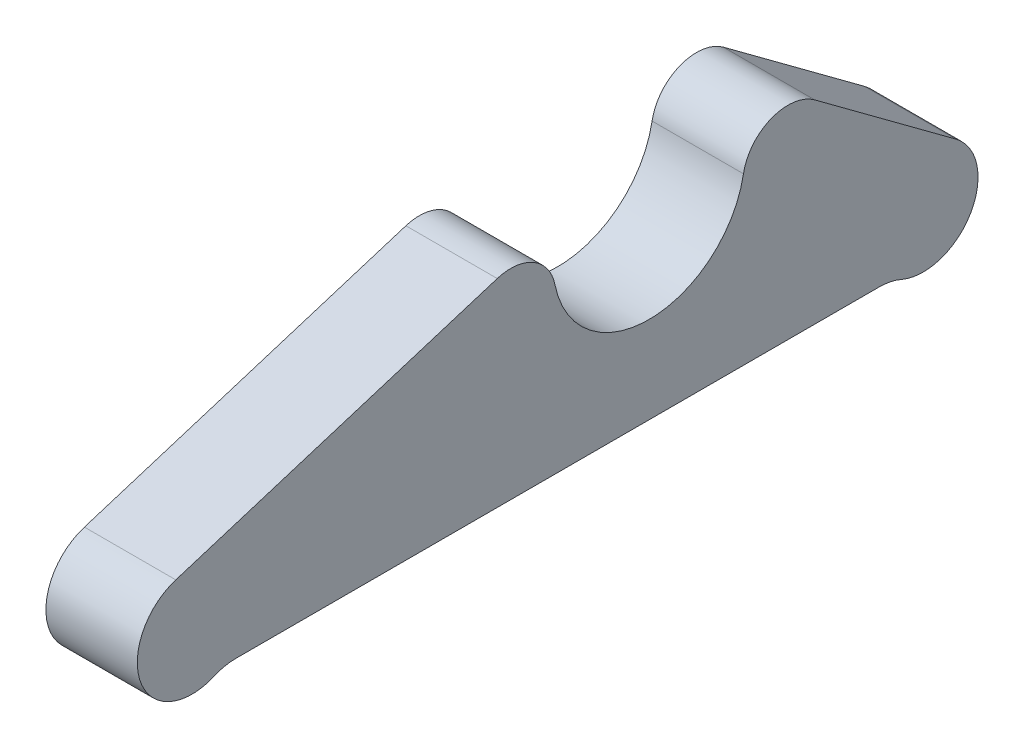
ISO-10303-21;
HEADER;
FILE_DESCRIPTION(('STEP AP214'),'2;1');
FILE_NAME('part.step','',(''),(''),'','','');
FILE_SCHEMA(('AUTOMOTIVE_DESIGN { 1 0 10303 214 1 1 1 1 }'));
ENDSEC;
DATA;
#1=APPLICATION_CONTEXT('core data for automotive mechanical design processes');
#2=APPLICATION_PROTOCOL_DEFINITION('international standard','automotive_design',2000,#1);
#3=PRODUCT_CONTEXT('',#1,'mechanical');
#4=PRODUCT('Part','Part','',(#3));
#5=PRODUCT_RELATED_PRODUCT_CATEGORY('part','',(#4));
#6=PRODUCT_DEFINITION_FORMATION('','',#4);
#7=PRODUCT_DEFINITION_CONTEXT('part definition',#1,'design');
#8=PRODUCT_DEFINITION('design','',#6,#7);
#9=PRODUCT_DEFINITION_SHAPE('','',#8);
#10=(LENGTH_UNIT() NAMED_UNIT(*) SI_UNIT(.MILLI.,.METRE.));
#11=(NAMED_UNIT(*) PLANE_ANGLE_UNIT() SI_UNIT($,.RADIAN.));
#12=(NAMED_UNIT(*) SI_UNIT($,.STERADIAN.) SOLID_ANGLE_UNIT());
#13=UNCERTAINTY_MEASURE_WITH_UNIT(LENGTH_MEASURE(1.E-05),#10,'distance_accuracy_value','');
#14=(GEOMETRIC_REPRESENTATION_CONTEXT(3) GLOBAL_UNCERTAINTY_ASSIGNED_CONTEXT((#13)) GLOBAL_UNIT_ASSIGNED_CONTEXT((#10,
#11,#12)) REPRESENTATION_CONTEXT('',''));
#15=CARTESIAN_POINT('',(0.,0.,0.));
#16=DIRECTION('',(0.,0.,1.));
#17=DIRECTION('',(1.,0.,0.));
#18=AXIS2_PLACEMENT_3D('',#15,#16,#17);
#19=CARTESIAN_POINT('',(10.,-15.,50.));
#20=DIRECTION('',(-1.,0.,0.));
#21=DIRECTION('',(0.,0.,1.));
#22=AXIS2_PLACEMENT_3D('',#19,#20,#21);
#23=CYLINDRICAL_SURFACE('',#22,6.);
#24=CARTESIAN_POINT('',(0.,-15.,50.));
#25=DIRECTION('',(1.,0.,0.));
#26=DIRECTION('',(0.,0.,-1.));
#27=AXIS2_PLACEMENT_3D('',#24,#25,#26);
#28=CIRCLE('',#27,6.);
#29=CARTESIAN_POINT('',(0.,-9.27202973874664,51.7861569601233));
#30=VERTEX_POINT('',#29);
#31=CARTESIAN_POINT('',(0.,-20.5,47.6020842383436));
#32=VERTEX_POINT('',#31);
#33=EDGE_CURVE('E152',#30,#32,#28,.T.);
#34=ORIENTED_EDGE('',*,*,#33,.T.);
#35=DIRECTION('',(-1.,0.,0.));
#36=VECTOR('',#35,1.);
#37=CARTESIAN_POINT('',(10.,-20.5,47.6020842383436));
#38=LINE('',#37,#36);
#39=CARTESIAN_POINT('',(10.,-20.5,47.6020842383436));
#40=VERTEX_POINT('',#39);
#41=EDGE_CURVE('E11',#40,#32,#38,.T.);
#42=ORIENTED_EDGE('',*,*,#41,.F.);
#43=CARTESIAN_POINT('',(10.,-15.,50.));
#44=DIRECTION('',(1.,0.,0.));
#45=DIRECTION('',(0.,0.,-1.));
#46=AXIS2_PLACEMENT_3D('',#43,#44,#45);
#47=CIRCLE('',#46,6.);
#48=CARTESIAN_POINT('',(10.,-9.27202973874664,51.7861569601233));
#49=VERTEX_POINT('',#48);
#50=EDGE_CURVE('E180',#49,#40,#47,.T.);
#51=ORIENTED_EDGE('',*,*,#50,.F.);
#52=DIRECTION('',(-1.,0.,0.));
#53=VECTOR('',#52,1.);
#54=CARTESIAN_POINT('',(10.,-9.27202973874664,51.7861569601233));
#55=LINE('',#54,#53);
#56=EDGE_CURVE('E148',#49,#30,#55,.T.);
#57=ORIENTED_EDGE('',*,*,#56,.T.);
#58=EDGE_LOOP('',(#34,#42,#51,#57));
#59=FACE_BOUND('',#58,.T.);
#60=ADVANCED_FACE('F39',(#59),#23,.T.);
#61=CARTESIAN_POINT('',(10.,-26.,45.2041684766873));
#62=DIRECTION('',(-1.,0.,0.));
#63=DIRECTION('',(0.,0.,1.));
#64=AXIS2_PLACEMENT_3D('',#61,#62,#63);
#65=CYLINDRICAL_SURFACE('',#64,6.);
#66=CARTESIAN_POINT('',(0.,-26.,45.2041684766873));
#67=DIRECTION('',(-1.,0.,0.));
#68=DIRECTION('',(0.,0.,-1.));
#69=AXIS2_PLACEMENT_3D('',#66,#67,#68);
#70=CIRCLE('',#69,6.);
#71=CARTESIAN_POINT('',(0.,-20.,45.2041684766873));
#72=VERTEX_POINT('',#71);
#73=EDGE_CURVE('E156',#32,#72,#70,.T.);
#74=ORIENTED_EDGE('',*,*,#73,.T.);
#75=DIRECTION('',(-1.,0.,0.));
#76=VECTOR('',#75,1.);
#77=CARTESIAN_POINT('',(10.,-20.,45.2041684766873));
#78=LINE('',#77,#76);
#79=CARTESIAN_POINT('',(10.,-20.,45.2041684766873));
#80=VERTEX_POINT('',#79);
#81=EDGE_CURVE('E48',#80,#72,#78,.T.);
#82=ORIENTED_EDGE('',*,*,#81,.F.);
#83=CARTESIAN_POINT('',(10.,-26.,45.2041684766873));
#84=DIRECTION('',(-1.,0.,0.));
#85=DIRECTION('',(0.,0.,-1.));
#86=AXIS2_PLACEMENT_3D('',#83,#84,#85);
#87=CIRCLE('',#86,6.);
#88=EDGE_CURVE('E105',#40,#80,#87,.T.);
#89=ORIENTED_EDGE('',*,*,#88,.F.);
#90=ORIENTED_EDGE('',*,*,#41,.T.);
#91=EDGE_LOOP('',(#74,#82,#89,#90));
#92=FACE_BOUND('',#91,.T.);
#93=ADVANCED_FACE('F244',(#92),#65,.F.);
#94=CARTESIAN_POINT('',(10.,-20.,45.2041684766873));
#95=DIRECTION('',(0.,1.,0.));
#96=DIRECTION('',(0.,0.,1.));
#97=AXIS2_PLACEMENT_3D('',#94,#95,#96);
#98=PLANE('',#97);
#99=DIRECTION('',(0.,0.,-1.));
#100=VECTOR('',#99,1.);
#101=CARTESIAN_POINT('',(0.,-20.,45.2041684766873));
#102=LINE('',#101,#100);
#103=CARTESIAN_POINT('',(0.,-20.,-25.2041684766873));
#104=VERTEX_POINT('',#103);
#105=EDGE_CURVE('E159',#72,#104,#102,.T.);
#106=ORIENTED_EDGE('',*,*,#105,.T.);
#107=DIRECTION('',(-1.,0.,0.));
#108=VECTOR('',#107,1.);
#109=CARTESIAN_POINT('',(10.,-20.,-25.2041684766873));
#110=LINE('',#109,#108);
#111=CARTESIAN_POINT('',(10.,-20.,-25.2041684766873));
#112=VERTEX_POINT('',#111);
#113=EDGE_CURVE('E199',#112,#104,#110,.T.);
#114=ORIENTED_EDGE('',*,*,#113,.F.);
#115=DIRECTION('',(0.,0.,-1.));
#116=VECTOR('',#115,1.);
#117=CARTESIAN_POINT('',(10.,-20.,45.2041684766873));
#118=LINE('',#117,#116);
#119=EDGE_CURVE('E209',#80,#112,#118,.T.);
#120=ORIENTED_EDGE('',*,*,#119,.F.);
#121=ORIENTED_EDGE('',*,*,#81,.T.);
#122=EDGE_LOOP('',(#106,#114,#120,#121));
#123=FACE_BOUND('',#122,.T.);
#124=ADVANCED_FACE('F207',(#123),#98,.F.);
#125=CARTESIAN_POINT('',(10.,-26.,-25.2041684766873));
#126=DIRECTION('',(-1.,0.,0.));
#127=DIRECTION('',(0.,0.,1.));
#128=AXIS2_PLACEMENT_3D('',#125,#126,#127);
#129=CYLINDRICAL_SURFACE('',#128,6.);
#130=CARTESIAN_POINT('',(0.,-26.,-25.2041684766873));
#131=DIRECTION('',(-1.,0.,0.));
#132=DIRECTION('',(0.,0.,1.));
#133=AXIS2_PLACEMENT_3D('',#130,#131,#132);
#134=CIRCLE('',#133,6.);
#135=CARTESIAN_POINT('',(0.,-20.5,-27.6020842383436));
#136=VERTEX_POINT('',#135);
#137=EDGE_CURVE('E162',#104,#136,#134,.T.);
#138=ORIENTED_EDGE('',*,*,#137,.T.);
#139=DIRECTION('',(-1.,0.,0.));
#140=VECTOR('',#139,1.);
#141=CARTESIAN_POINT('',(10.,-20.5,-27.6020842383436));
#142=LINE('',#141,#140);
#143=CARTESIAN_POINT('',(10.,-20.5,-27.6020842383436));
#144=VERTEX_POINT('',#143);
#145=EDGE_CURVE('E195',#144,#136,#142,.T.);
#146=ORIENTED_EDGE('',*,*,#145,.F.);
#147=CARTESIAN_POINT('',(10.,-26.,-25.2041684766873));
#148=DIRECTION('',(-1.,0.,0.));
#149=DIRECTION('',(0.,0.,1.));
#150=AXIS2_PLACEMENT_3D('',#147,#148,#149);
#151=CIRCLE('',#150,6.);
#152=EDGE_CURVE('E228',#112,#144,#151,.T.);
#153=ORIENTED_EDGE('',*,*,#152,.F.);
#154=ORIENTED_EDGE('',*,*,#113,.T.);
#155=EDGE_LOOP('',(#138,#146,#153,#154));
#156=FACE_BOUND('',#155,.T.);
#157=ADVANCED_FACE('F218',(#156),#129,.F.);
#158=CARTESIAN_POINT('',(10.,-15.,-30.));
#159=DIRECTION('',(-1.,0.,0.));
#160=DIRECTION('',(0.,0.,1.));
#161=AXIS2_PLACEMENT_3D('',#158,#159,#160);
#162=CYLINDRICAL_SURFACE('',#161,6.);
#163=CARTESIAN_POINT('',(0.,-15.,-30.));
#164=DIRECTION('',(1.,0.,0.));
#165=DIRECTION('',(0.,0.,1.));
#166=AXIS2_PLACEMENT_3D('',#163,#164,#165);
#167=CIRCLE('',#166,6.);
#168=CARTESIAN_POINT('',(0.,-10.1780659532109,-33.5705674686828));
#169=VERTEX_POINT('',#168);
#170=EDGE_CURVE('E165',#136,#169,#167,.T.);
#171=ORIENTED_EDGE('',*,*,#170,.T.);
#172=DIRECTION('',(-1.,0.,0.));
#173=VECTOR('',#172,1.);
#174=CARTESIAN_POINT('',(10.,-10.1780659532109,-33.5705674686828));
#175=LINE('',#174,#173);
#176=CARTESIAN_POINT('',(10.,-10.1780659532109,-33.5705674686828));
#177=VERTEX_POINT('',#176);
#178=EDGE_CURVE('E191',#177,#169,#175,.T.);
#179=ORIENTED_EDGE('',*,*,#178,.F.);
#180=CARTESIAN_POINT('',(10.,-15.,-30.));
#181=DIRECTION('',(1.,0.,0.));
#182=DIRECTION('',(0.,0.,1.));
#183=AXIS2_PLACEMENT_3D('',#180,#181,#182);
#184=CIRCLE('',#183,6.);
#185=EDGE_CURVE('E224',#144,#177,#184,.T.);
#186=ORIENTED_EDGE('',*,*,#185,.F.);
#187=ORIENTED_EDGE('',*,*,#145,.T.);
#188=EDGE_LOOP('',(#171,#179,#186,#187));
#189=FACE_BOUND('',#188,.T.);
#190=ADVANCED_FACE('F222',(#189),#162,.T.);
#191=CARTESIAN_POINT('',(10.,-10.1780659532109,-33.5705674686828));
#192=DIRECTION('',(0.,-0.803655674464858,0.595094578113795));
#193=DIRECTION('',(0.,-0.595094578113795,-0.803655674464858));
#194=AXIS2_PLACEMENT_3D('',#191,#192,#193);
#195=PLANE('',#194);
#196=DIRECTION('',(0.,0.595094578113794,0.803655674464857));
#197=VECTOR('',#196,1.);
#198=CARTESIAN_POINT('',(0.,-10.1780659532109,-33.5705674686828));
#199=LINE('',#198,#197);
#200=CARTESIAN_POINT('',(0.,1.25121116765543,-18.1357042536138));
#201=VERTEX_POINT('',#200);
#202=EDGE_CURVE('E168',#169,#201,#199,.T.);
#203=ORIENTED_EDGE('',*,*,#202,.T.);
#204=DIRECTION('',(-1.,0.,0.));
#205=VECTOR('',#204,1.);
#206=CARTESIAN_POINT('',(10.,1.25121116765543,-18.1357042536138));
#207=LINE('',#206,#205);
#208=CARTESIAN_POINT('',(10.,1.25121116765543,-18.1357042536138));
#209=VERTEX_POINT('',#208);
#210=EDGE_CURVE('E187',#209,#201,#207,.T.);
#211=ORIENTED_EDGE('',*,*,#210,.F.);
#212=DIRECTION('',(0.,0.595094578113794,0.803655674464857));
#213=VECTOR('',#212,1.);
#214=CARTESIAN_POINT('',(10.,-10.1780659532109,-33.5705674686828));
#215=LINE('',#214,#213);
#216=EDGE_CURVE('E227',#177,#209,#215,.T.);
#217=ORIENTED_EDGE('',*,*,#216,.F.);
#218=ORIENTED_EDGE('',*,*,#178,.T.);
#219=EDGE_LOOP('',(#203,#211,#217,#218));
#220=FACE_BOUND('',#219,.T.);
#221=ADVANCED_FACE('F256',(#220),#195,.F.);
#222=CARTESIAN_POINT('',(10.,-2.71960212207013,-15.1953785214632));
#223=DIRECTION('',(-1.,0.,0.));
#224=DIRECTION('',(0.,0.,1.));
#225=AXIS2_PLACEMENT_3D('',#222,#223,#224);
#226=CYLINDRICAL_SURFACE('',#225,4.94093853361973);
#227=CARTESIAN_POINT('',(0.,-2.71960212207013,-15.1953785214632));
#228=DIRECTION('',(1.,0.,0.));
#229=DIRECTION('',(0.,0.,-1.));
#230=AXIS2_PLACEMENT_3D('',#227,#228,#229);
#231=CIRCLE('',#230,4.94093853361973);
#232=CARTESIAN_POINT('',(0.,-1.84912640328891,-10.3317229399052));
#233=VERTEX_POINT('',#232);
#234=EDGE_CURVE('E171',#201,#233,#231,.T.);
#235=ORIENTED_EDGE('',*,*,#234,.T.);
#236=DIRECTION('',(-1.,0.,0.));
#237=VECTOR('',#236,1.);
#238=CARTESIAN_POINT('',(10.,-1.84912640328891,-10.3317229399052));
#239=LINE('',#238,#237);
#240=CARTESIAN_POINT('',(10.,-1.84912640328891,-10.3317229399052));
#241=VERTEX_POINT('',#240);
#242=EDGE_CURVE('E141',#241,#233,#239,.T.);
#243=ORIENTED_EDGE('',*,*,#242,.F.);
#244=CARTESIAN_POINT('',(10.,-2.71960212207013,-15.1953785214632));
#245=DIRECTION('',(1.,0.,0.));
#246=DIRECTION('',(0.,0.,-1.));
#247=AXIS2_PLACEMENT_3D('',#244,#245,#246);
#248=CIRCLE('',#247,4.94093853361973);
#249=EDGE_CURVE('E130',#209,#241,#248,.T.);
#250=ORIENTED_EDGE('',*,*,#249,.F.);
#251=ORIENTED_EDGE('',*,*,#210,.T.);
#252=EDGE_LOOP('',(#235,#243,#250,#251));
#253=FACE_BOUND('',#252,.T.);
#254=ADVANCED_FACE('F259',(#253),#226,.T.);
#255=CARTESIAN_POINT('',(10.,0.,0.));
#256=DIRECTION('',(-1.,0.,0.));
#257=DIRECTION('',(0.,0.,1.));
#258=AXIS2_PLACEMENT_3D('',#255,#256,#257);
#259=CYLINDRICAL_SURFACE('',#258,10.4958928806607);
#260=CARTESIAN_POINT('',(0.,0.,0.));
#261=DIRECTION('',(-1.,0.,0.));
#262=DIRECTION('',(0.,0.,-1.));
#263=AXIS2_PLACEMENT_3D('',#260,#261,#262);
#264=CIRCLE('',#263,10.4958928806607);
#265=CARTESIAN_POINT('',(0.,-2.05322632754182,10.2931058971621));
#266=VERTEX_POINT('',#265);
#267=EDGE_CURVE('E139',#233,#266,#264,.T.);
#268=ORIENTED_EDGE('',*,*,#267,.T.);
#269=DIRECTION('',(-1.,0.,0.));
#270=VECTOR('',#269,1.);
#271=CARTESIAN_POINT('',(10.,-2.05322632754182,10.2931058971621));
#272=LINE('',#271,#270);
#273=CARTESIAN_POINT('',(10.,-2.05322632754182,10.2931058971621));
#274=VERTEX_POINT('',#273);
#275=EDGE_CURVE('E136',#274,#266,#272,.T.);
#276=ORIENTED_EDGE('',*,*,#275,.F.);
#277=CARTESIAN_POINT('',(10.,0.,0.));
#278=DIRECTION('',(-1.,0.,0.));
#279=DIRECTION('',(0.,0.,-1.));
#280=AXIS2_PLACEMENT_3D('',#277,#278,#279);
#281=CIRCLE('',#280,10.4958928806607);
#282=EDGE_CURVE('E124',#241,#274,#281,.T.);
#283=ORIENTED_EDGE('',*,*,#282,.F.);
#284=ORIENTED_EDGE('',*,*,#242,.T.);
#285=EDGE_LOOP('',(#268,#276,#283,#284));
#286=FACE_BOUND('',#285,.T.);
#287=ADVANCED_FACE('F137',(#286),#259,.F.);
#288=CARTESIAN_POINT('',(10.,-3.01978202655114,15.1385825170335));
#289=DIRECTION('',(-1.,0.,0.));
#290=DIRECTION('',(0.,0.,1.));
#291=AXIS2_PLACEMENT_3D('',#288,#289,#290);
#292=CYLINDRICAL_SURFACE('',#291,4.94093853361972);
#293=CARTESIAN_POINT('',(0.,-3.01978202655114,15.1385825170335));
#294=DIRECTION('',(1.,0.,0.));
#295=DIRECTION('',(0.,0.,1.));
#296=AXIS2_PLACEMENT_3D('',#293,#294,#295);
#297=CIRCLE('',#296,4.94093853361972);
#298=CARTESIAN_POINT('',(0.,1.69714280399128,16.6094644755946));
#299=VERTEX_POINT('',#298);
#300=EDGE_CURVE('E91',#266,#299,#297,.T.);
#301=ORIENTED_EDGE('',*,*,#300,.T.);
#302=DIRECTION('',(-1.,0.,0.));
#303=VECTOR('',#302,1.);
#304=CARTESIAN_POINT('',(10.,1.69714280399128,16.6094644755946));
#305=LINE('',#304,#303);
#306=CARTESIAN_POINT('',(10.,1.69714280399128,16.6094644755946));
#307=VERTEX_POINT('',#306);
#308=EDGE_CURVE('E142',#307,#299,#305,.T.);
#309=ORIENTED_EDGE('',*,*,#308,.F.);
#310=CARTESIAN_POINT('',(10.,-3.01978202655114,15.1385825170335));
#311=DIRECTION('',(1.,0.,0.));
#312=DIRECTION('',(0.,0.,1.));
#313=AXIS2_PLACEMENT_3D('',#310,#311,#312);
#314=CIRCLE('',#313,4.94093853361972);
#315=EDGE_CURVE('E128',#274,#307,#314,.T.);
#316=ORIENTED_EDGE('',*,*,#315,.F.);
#317=ORIENTED_EDGE('',*,*,#275,.T.);
#318=EDGE_LOOP('',(#301,#309,#316,#317));
#319=FACE_BOUND('',#318,.T.);
#320=ADVANCED_FACE('F144',(#319),#292,.T.);
#321=CARTESIAN_POINT('',(10.,-9.27202973874664,51.7861569601233));
#322=DIRECTION('',(0.,-0.954661710208894,-0.297692826687225));
#323=DIRECTION('',(0.,0.297692826687225,-0.954661710208894));
#324=AXIS2_PLACEMENT_3D('',#321,#322,#323);
#325=PLANE('',#324);
#326=DIRECTION('',(0.,-0.297692826687225,0.954661710208894));
#327=VECTOR('',#326,1.);
#328=CARTESIAN_POINT('',(0.,-9.27202973874664,51.7861569601233));
#329=LINE('',#328,#327);
#330=EDGE_CURVE('E97',#299,#30,#329,.T.);
#331=ORIENTED_EDGE('',*,*,#330,.T.);
#332=ORIENTED_EDGE('',*,*,#56,.F.);
#333=DIRECTION('',(0.,-0.297692826687225,0.954661710208894));
#334=VECTOR('',#333,1.);
#335=CARTESIAN_POINT('',(10.,-9.27202973874664,51.7861569601233));
#336=LINE('',#335,#334);
#337=EDGE_CURVE('E56',#307,#49,#336,.T.);
#338=ORIENTED_EDGE('',*,*,#337,.F.);
#339=ORIENTED_EDGE('',*,*,#308,.T.);
#340=EDGE_LOOP('',(#331,#332,#338,#339));
#341=FACE_BOUND('',#340,.T.);
#342=ADVANCED_FACE('F268',(#341),#325,.F.);
#343=CARTESIAN_POINT('',(10.,-15.,50.));
#344=DIRECTION('',(1.,0.,0.));
#345=DIRECTION('',(0.,0.,-1.));
#346=AXIS2_PLACEMENT_3D('',#343,#344,#345);
#347=PLANE('',#346);
#348=ORIENTED_EDGE('',*,*,#50,.T.);
#349=ORIENTED_EDGE('',*,*,#88,.T.);
#350=ORIENTED_EDGE('',*,*,#119,.T.);
#351=ORIENTED_EDGE('',*,*,#152,.T.);
#352=ORIENTED_EDGE('',*,*,#185,.T.);
#353=ORIENTED_EDGE('',*,*,#216,.T.);
#354=ORIENTED_EDGE('',*,*,#249,.T.);
#355=ORIENTED_EDGE('',*,*,#282,.T.);
#356=ORIENTED_EDGE('',*,*,#315,.T.);
#357=ORIENTED_EDGE('',*,*,#337,.T.);
#358=EDGE_LOOP('',(#348,#349,#350,#351,#352,#353,#354,#355,#356,#357));
#359=FACE_BOUND('',#358,.T.);
#360=ADVANCED_FACE('F126',(#359),#347,.T.);
#361=CARTESIAN_POINT('',(0.,-15.,50.));
#362=DIRECTION('',(1.,0.,0.));
#363=DIRECTION('',(0.,0.,-1.));
#364=AXIS2_PLACEMENT_3D('',#361,#362,#363);
#365=PLANE('',#364);
#366=ORIENTED_EDGE('',*,*,#33,.F.);
#367=ORIENTED_EDGE('',*,*,#330,.F.);
#368=ORIENTED_EDGE('',*,*,#300,.F.);
#369=ORIENTED_EDGE('',*,*,#267,.F.);
#370=ORIENTED_EDGE('',*,*,#234,.F.);
#371=ORIENTED_EDGE('',*,*,#202,.F.);
#372=ORIENTED_EDGE('',*,*,#170,.F.);
#373=ORIENTED_EDGE('',*,*,#137,.F.);
#374=ORIENTED_EDGE('',*,*,#105,.F.);
#375=ORIENTED_EDGE('',*,*,#73,.F.);
#376=EDGE_LOOP('',(#366,#367,#368,#369,#370,#371,#372,#373,#374,#375));
#377=FACE_BOUND('',#376,.T.);
#378=ADVANCED_FACE('F213',(#377),#365,.F.);
#379=CLOSED_SHELL('',(#60,#93,#124,#157,#190,#221,#254,#287,#320,#342,#360,#378));
#380=MANIFOLD_SOLID_BREP('B2',#379);
#381=ADVANCED_BREP_SHAPE_REPRESENTATION('',(#18,#380),#14);
#382=SHAPE_DEFINITION_REPRESENTATION(#9,#381);
ENDSEC;
END-ISO-10303-21;
